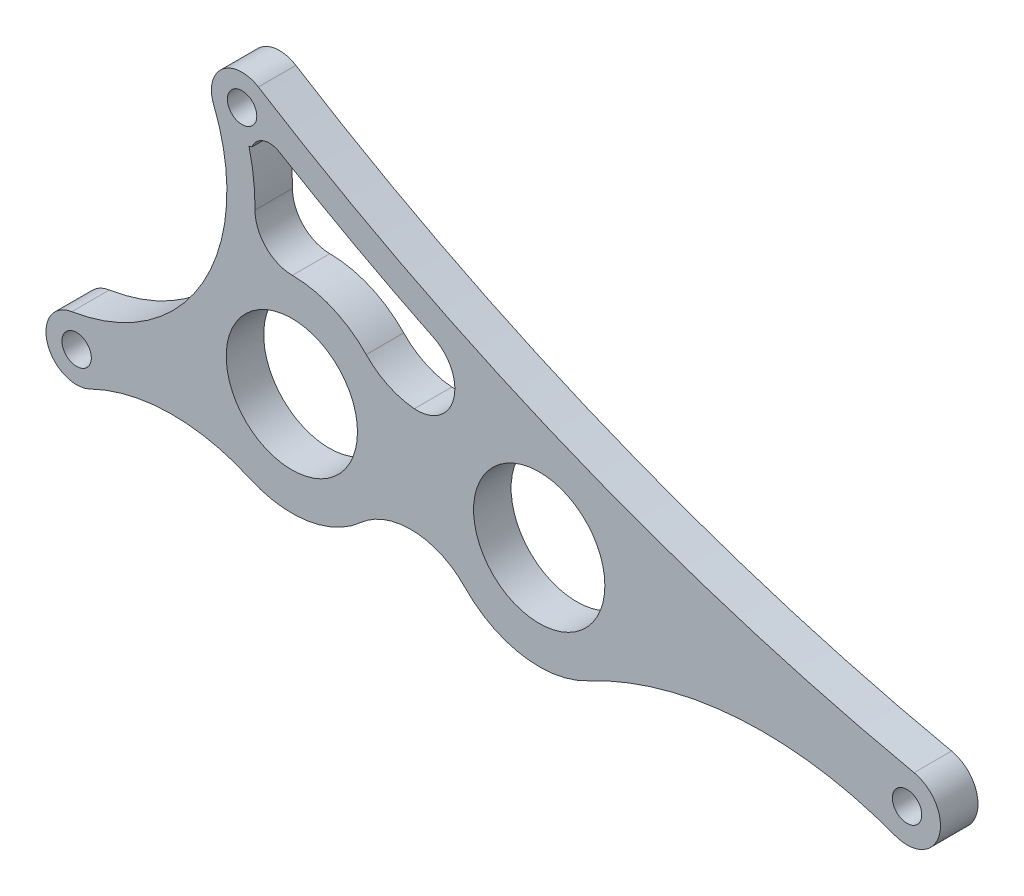
ISO-10303-21;
HEADER;
FILE_DESCRIPTION(('STEP AP214'),'2;1');
FILE_NAME('part.step','',(''),(''),'','','');
FILE_SCHEMA(('AUTOMOTIVE_DESIGN { 1 0 10303 214 1 1 1 1 }'));
ENDSEC;
DATA;
#1=APPLICATION_CONTEXT('core data for automotive mechanical design processes');
#2=APPLICATION_PROTOCOL_DEFINITION('international standard','automotive_design',2000,#1);
#3=PRODUCT_CONTEXT('',#1,'mechanical');
#4=PRODUCT('Part','Part','',(#3));
#5=PRODUCT_RELATED_PRODUCT_CATEGORY('part','',(#4));
#6=PRODUCT_DEFINITION_FORMATION('','',#4);
#7=PRODUCT_DEFINITION_CONTEXT('part definition',#1,'design');
#8=PRODUCT_DEFINITION('design','',#6,#7);
#9=PRODUCT_DEFINITION_SHAPE('','',#8);
#10=(LENGTH_UNIT() NAMED_UNIT(*) SI_UNIT(.MILLI.,.METRE.));
#11=(NAMED_UNIT(*) PLANE_ANGLE_UNIT() SI_UNIT($,.RADIAN.));
#12=(NAMED_UNIT(*) SI_UNIT($,.STERADIAN.) SOLID_ANGLE_UNIT());
#13=UNCERTAINTY_MEASURE_WITH_UNIT(LENGTH_MEASURE(1.E-05),#10,'distance_accuracy_value','');
#14=(GEOMETRIC_REPRESENTATION_CONTEXT(3) GLOBAL_UNCERTAINTY_ASSIGNED_CONTEXT((#13)) GLOBAL_UNIT_ASSIGNED_CONTEXT((#10,
#11,#12)) REPRESENTATION_CONTEXT('',''));
#15=CARTESIAN_POINT('',(0.,0.,0.));
#16=DIRECTION('',(0.,0.,1.));
#17=DIRECTION('',(1.,0.,0.));
#18=AXIS2_PLACEMENT_3D('',#15,#16,#17);
#19=CARTESIAN_POINT('',(632.61066878042,506.895195811641,6.35));
#20=DIRECTION('',(0.,0.,-1.));
#21=DIRECTION('',(-1.,0.,0.));
#22=AXIS2_PLACEMENT_3D('',#19,#20,#21);
#23=CYLINDRICAL_SURFACE('',#22,350.88304049089);
#24=CARTESIAN_POINT('',(632.61066878042,506.895195811641,0.));
#25=DIRECTION('',(0.,0.,1.));
#26=DIRECTION('',(1.,0.,0.));
#27=AXIS2_PLACEMENT_3D('',#24,#25,#26);
#28=CIRCLE('',#27,350.88304049089);
#29=CARTESIAN_POINT('',(478.677557343636,191.58026545229,0.));
#30=VERTEX_POINT('',#29);
#31=CARTESIAN_POINT('',(452.492063574284,205.770311149599,0.));
#32=VERTEX_POINT('',#31);
#33=EDGE_CURVE('E232',#30,#32,#28,.F.);
#34=ORIENTED_EDGE('',*,*,#33,.F.);
#35=DIRECTION('',(0.,0.,-1.));
#36=VECTOR('',#35,1.);
#37=CARTESIAN_POINT('',(478.677557343636,191.58026545229,6.35));
#38=LINE('',#37,#36);
#39=CARTESIAN_POINT('',(478.677557343636,191.58026545229,6.35));
#40=VERTEX_POINT('',#39);
#41=EDGE_CURVE('E200',#30,#40,#38,.F.);
#42=ORIENTED_EDGE('',*,*,#41,.T.);
#43=CARTESIAN_POINT('',(632.61066878042,506.895195811641,6.35));
#44=DIRECTION('',(0.,0.,1.));
#45=DIRECTION('',(1.,0.,0.));
#46=AXIS2_PLACEMENT_3D('',#43,#44,#45);
#47=CIRCLE('',#46,350.88304049089);
#48=CARTESIAN_POINT('',(452.492063574284,205.770311149599,6.35));
#49=VERTEX_POINT('',#48);
#50=EDGE_CURVE('E216',#40,#49,#47,.F.);
#51=ORIENTED_EDGE('',*,*,#50,.T.);
#52=DIRECTION('',(0.,0.,-1.));
#53=VECTOR('',#52,1.);
#54=CARTESIAN_POINT('',(452.492063574284,205.770311149599,6.35));
#55=LINE('',#54,#53);
#56=EDGE_CURVE('E188',#49,#32,#55,.T.);
#57=ORIENTED_EDGE('',*,*,#56,.T.);
#58=EDGE_LOOP('',(#34,#42,#51,#57));
#59=FACE_BOUND('',#58,.T.);
#60=ADVANCED_FACE('F37',(#59),#23,.T.);
#61=CARTESIAN_POINT('',(476.397755762043,192.203759657229,6.35));
#62=DIRECTION('',(0.,0.,-1.));
#63=DIRECTION('',(-1.,0.,0.));
#64=AXIS2_PLACEMENT_3D('',#61,#62,#63);
#65=CYLINDRICAL_SURFACE('',#64,12.7);
#66=CARTESIAN_POINT('',(476.397755762043,192.203759657229,6.35));
#67=DIRECTION('',(0.,0.,1.));
#68=DIRECTION('',(1.,0.,0.));
#69=AXIS2_PLACEMENT_3D('',#66,#67,#68);
#70=CIRCLE('',#69,12.7);
#71=CARTESIAN_POINT('',(475.385842808314,179.54413753909,6.35));
#72=VERTEX_POINT('',#71);
#73=CARTESIAN_POINT('',(467.238937845187,183.40568859785,6.35));
#74=VERTEX_POINT('',#73);
#75=EDGE_CURVE('E214',#72,#74,#70,.F.);
#76=ORIENTED_EDGE('',*,*,#75,.F.);
#77=DIRECTION('',(0.,0.,-1.));
#78=VECTOR('',#77,1.);
#79=CARTESIAN_POINT('',(475.385842808314,179.54413753909,6.35));
#80=LINE('',#79,#78);
#81=CARTESIAN_POINT('',(475.385842808314,179.54413753909,0.));
#82=VERTEX_POINT('',#81);
#83=EDGE_CURVE('E197',#72,#82,#80,.T.);
#84=ORIENTED_EDGE('',*,*,#83,.T.);
#85=CARTESIAN_POINT('',(476.397755762043,192.203759657229,0.));
#86=DIRECTION('',(0.,0.,1.));
#87=DIRECTION('',(1.,0.,0.));
#88=AXIS2_PLACEMENT_3D('',#85,#86,#87);
#89=CIRCLE('',#88,12.7);
#90=CARTESIAN_POINT('',(467.238937845187,183.40568859785,0.));
#91=VERTEX_POINT('',#90);
#92=EDGE_CURVE('E233',#82,#91,#89,.F.);
#93=ORIENTED_EDGE('',*,*,#92,.T.);
#94=DIRECTION('',(0.,0.,-1.));
#95=VECTOR('',#94,1.);
#96=CARTESIAN_POINT('',(467.238937845187,183.40568859785,6.35));
#97=LINE('',#96,#95);
#98=EDGE_CURVE('E201',#74,#91,#97,.T.);
#99=ORIENTED_EDGE('',*,*,#98,.F.);
#100=EDGE_LOOP('',(#76,#84,#93,#99));
#101=FACE_BOUND('',#100,.T.);
#102=ADVANCED_FACE('F222',(#101),#65,.F.);
#103=CARTESIAN_POINT('',(454.64556320951,171.308340891204,6.35));
#104=DIRECTION('',(0.,0.,-1.));
#105=DIRECTION('',(-1.,0.,0.));
#106=AXIS2_PLACEMENT_3D('',#103,#104,#105);
#107=CYLINDRICAL_SURFACE('',#106,17.4625);
#108=CARTESIAN_POINT('',(454.64556320951,171.308340891204,0.));
#109=DIRECTION('',(0.,0.,1.));
#110=DIRECTION('',(1.,0.,0.));
#111=AXIS2_PLACEMENT_3D('',#108,#109,#110);
#112=CIRCLE('',#111,17.4625);
#113=CARTESIAN_POINT('',(454.73164697502,188.770628709108,0.));
#114=VERTEX_POINT('',#113);
#115=EDGE_CURVE('E239',#91,#114,#112,.T.);
#116=ORIENTED_EDGE('',*,*,#115,.T.);
#117=DIRECTION('',(0.,0.,-1.));
#118=VECTOR('',#117,1.);
#119=CARTESIAN_POINT('',(454.73164697502,188.770628709108,6.35));
#120=LINE('',#119,#118);
#121=CARTESIAN_POINT('',(454.73164697502,188.770628709108,6.35));
#122=VERTEX_POINT('',#121);
#123=EDGE_CURVE('E52',#114,#122,#120,.F.);
#124=ORIENTED_EDGE('',*,*,#123,.T.);
#125=CARTESIAN_POINT('',(454.64556320951,171.308340891204,6.35));
#126=DIRECTION('',(0.,0.,1.));
#127=DIRECTION('',(1.,0.,0.));
#128=AXIS2_PLACEMENT_3D('',#125,#126,#127);
#129=CIRCLE('',#128,17.4625);
#130=EDGE_CURVE('E225',#74,#122,#129,.T.);
#131=ORIENTED_EDGE('',*,*,#130,.F.);
#132=ORIENTED_EDGE('',*,*,#98,.T.);
#133=EDGE_LOOP('',(#116,#124,#131,#132));
#134=FACE_BOUND('',#133,.T.);
#135=ADVANCED_FACE('F390',(#134),#107,.T.);
#136=CARTESIAN_POINT('',(412.506160535641,195.538311775231,6.35));
#137=DIRECTION('',(0.,0.,-1.));
#138=DIRECTION('',(-1.,0.,0.));
#139=AXIS2_PLACEMENT_3D('',#136,#137,#138);
#140=CYLINDRICAL_SURFACE('',#139,35.9088546126245);
#141=CARTESIAN_POINT('',(412.506160535641,195.538311775231,6.35));
#142=DIRECTION('',(0.,0.,1.));
#143=DIRECTION('',(1.,0.,0.));
#144=AXIS2_PLACEMENT_3D('',#141,#142,#143);
#145=CIRCLE('',#144,35.9088546126245);
#146=CARTESIAN_POINT('',(448.413260456259,195.183326027106,6.35));
#147=VERTEX_POINT('',#146);
#148=CARTESIAN_POINT('',(447.393688423649,204.041619217284,6.35));
#149=VERTEX_POINT('',#148);
#150=EDGE_CURVE('E350',#147,#149,#145,.T.);
#151=ORIENTED_EDGE('',*,*,#150,.F.);
#152=DIRECTION('',(0.,0.,-1.));
#153=VECTOR('',#152,1.);
#154=CARTESIAN_POINT('',(448.413260456259,195.183326027106,6.35));
#155=LINE('',#154,#153);
#156=CARTESIAN_POINT('',(448.413260456259,195.183326027106,0.));
#157=VERTEX_POINT('',#156);
#158=EDGE_CURVE('E203',#147,#157,#155,.T.);
#159=ORIENTED_EDGE('',*,*,#158,.T.);
#160=CARTESIAN_POINT('',(412.506160535641,195.538311775231,0.));
#161=DIRECTION('',(0.,0.,1.));
#162=DIRECTION('',(1.,0.,0.));
#163=AXIS2_PLACEMENT_3D('',#160,#161,#162);
#164=CIRCLE('',#163,35.9088546126245);
#165=CARTESIAN_POINT('',(447.393688423649,204.041619217284,0.));
#166=VERTEX_POINT('',#165);
#167=EDGE_CURVE('E245',#157,#166,#164,.T.);
#168=ORIENTED_EDGE('',*,*,#167,.T.);
#169=DIRECTION('',(0.,0.,-1.));
#170=VECTOR('',#169,1.);
#171=CARTESIAN_POINT('',(447.393688423649,204.041619217284,6.35));
#172=LINE('',#171,#170);
#173=EDGE_CURVE('E267',#149,#166,#172,.T.);
#174=ORIENTED_EDGE('',*,*,#173,.F.);
#175=EDGE_LOOP('',(#151,#159,#168,#174));
#176=FACE_BOUND('',#175,.T.);
#177=ADVANCED_FACE('F422',(#176),#140,.T.);
#178=CARTESIAN_POINT('',(446.22078607599,209.101762750116,6.35));
#179=DIRECTION('',(0.,0.,-1.));
#180=DIRECTION('',(-1.,0.,0.));
#181=AXIS2_PLACEMENT_3D('',#178,#179,#180);
#182=CYLINDRICAL_SURFACE('',#181,5.1943);
#183=CARTESIAN_POINT('',(446.22078607599,209.101762750116,0.));
#184=DIRECTION('',(0.,0.,1.));
#185=DIRECTION('',(1.,0.,0.));
#186=AXIS2_PLACEMENT_3D('',#183,#184,#185);
#187=CIRCLE('',#186,5.1943);
#188=CARTESIAN_POINT('',(447.899172428211,204.186096799028,0.));
#189=VERTEX_POINT('',#188);
#190=EDGE_CURVE('E247',#166,#189,#187,.T.);
#191=ORIENTED_EDGE('',*,*,#190,.T.);
#192=DIRECTION('',(0.,0.,-1.));
#193=VECTOR('',#192,1.);
#194=CARTESIAN_POINT('',(447.899172428211,204.186096799028,6.35));
#195=LINE('',#194,#193);
#196=CARTESIAN_POINT('',(447.899172428211,204.186096799028,6.35));
#197=VERTEX_POINT('',#196);
#198=EDGE_CURVE('E191',#197,#189,#195,.T.);
#199=ORIENTED_EDGE('',*,*,#198,.F.);
#200=CARTESIAN_POINT('',(446.22078607599,209.101762750116,6.35));
#201=DIRECTION('',(0.,0.,1.));
#202=DIRECTION('',(1.,0.,0.));
#203=AXIS2_PLACEMENT_3D('',#200,#201,#202);
#204=CIRCLE('',#203,5.1943);
#205=EDGE_CURVE('E348',#149,#197,#204,.T.);
#206=ORIENTED_EDGE('',*,*,#205,.F.);
#207=ORIENTED_EDGE('',*,*,#173,.T.);
#208=EDGE_LOOP('',(#191,#199,#206,#207));
#209=FACE_BOUND('',#208,.T.);
#210=ADVANCED_FACE('F419',(#209),#182,.T.);
#211=CARTESIAN_POINT('',(558.800000000003,162.941000000005,6.35));
#212=DIRECTION('',(0.,0.,-1.));
#213=DIRECTION('',(-1.,0.,0.));
#214=AXIS2_PLACEMENT_3D('',#211,#212,#213);
#215=CYLINDRICAL_SURFACE('',#214,5.66419999999934);
#216=CARTESIAN_POINT('',(558.800000000003,162.941000000005,0.));
#217=DIRECTION('',(0.,0.,1.));
#218=DIRECTION('',(1.,0.,0.));
#219=AXIS2_PLACEMENT_3D('',#216,#217,#218);
#220=CIRCLE('',#219,5.66419999999934);
#221=CARTESIAN_POINT('',(556.805506699175,157.639570182216,0.));
#222=VERTEX_POINT('',#221);
#223=CARTESIAN_POINT('',(559.98844947488,168.479117864917,0.));
#224=VERTEX_POINT('',#223);
#225=EDGE_CURVE('E187',#222,#224,#220,.T.);
#226=ORIENTED_EDGE('',*,*,#225,.T.);
#227=DIRECTION('',(0.,0.,-1.));
#228=VECTOR('',#227,1.);
#229=CARTESIAN_POINT('',(559.98844947488,168.479117864917,6.35));
#230=LINE('',#229,#228);
#231=CARTESIAN_POINT('',(559.98844947488,168.479117864917,6.35));
#232=VERTEX_POINT('',#231);
#233=EDGE_CURVE('E166',#232,#224,#230,.T.);
#234=ORIENTED_EDGE('',*,*,#233,.F.);
#235=CARTESIAN_POINT('',(558.800000000003,162.941000000005,6.35));
#236=DIRECTION('',(0.,0.,1.));
#237=DIRECTION('',(1.,0.,0.));
#238=AXIS2_PLACEMENT_3D('',#235,#236,#237);
#239=CIRCLE('',#238,5.66419999999934);
#240=CARTESIAN_POINT('',(556.805506699175,157.639570182216,6.35));
#241=VERTEX_POINT('',#240);
#242=EDGE_CURVE('E173',#241,#232,#239,.T.);
#243=ORIENTED_EDGE('',*,*,#242,.F.);
#244=DIRECTION('',(0.,0.,-1.));
#245=VECTOR('',#244,1.);
#246=CARTESIAN_POINT('',(556.805506699175,157.639570182216,6.35));
#247=LINE('',#246,#245);
#248=EDGE_CURVE('E271',#241,#222,#247,.T.);
#249=ORIENTED_EDGE('',*,*,#248,.T.);
#250=EDGE_LOOP('',(#226,#234,#243,#249));
#251=FACE_BOUND('',#250,.T.);
#252=ADVANCED_FACE('F185',(#251),#215,.T.);
#253=CARTESIAN_POINT('',(632.61066878042,506.895195811641,6.35));
#254=DIRECTION('',(0.,0.,-1.));
#255=DIRECTION('',(-1.,0.,0.));
#256=AXIS2_PLACEMENT_3D('',#253,#254,#255);
#257=CYLINDRICAL_SURFACE('',#256,346.12054049089);
#258=CARTESIAN_POINT('',(632.61066878042,506.895195811641,0.));
#259=DIRECTION('',(0.,0.,1.));
#260=DIRECTION('',(1.,0.,0.));
#261=AXIS2_PLACEMENT_3D('',#258,#259,#260);
#262=CIRCLE('',#261,346.12054049089);
#263=CARTESIAN_POINT('',(448.976618896428,213.504731970517,0.));
#264=VERTEX_POINT('',#263);
#265=EDGE_CURVE('E305',#224,#264,#262,.F.);
#266=ORIENTED_EDGE('',*,*,#265,.T.);
#267=DIRECTION('',(0.,0.,-1.));
#268=VECTOR('',#267,1.);
#269=CARTESIAN_POINT('',(448.976618896428,213.504731970517,6.35));
#270=LINE('',#269,#268);
#271=CARTESIAN_POINT('',(448.976618896428,213.504731970517,6.35));
#272=VERTEX_POINT('',#271);
#273=EDGE_CURVE('E169',#272,#264,#270,.T.);
#274=ORIENTED_EDGE('',*,*,#273,.F.);
#275=CARTESIAN_POINT('',(632.61066878042,506.895195811641,6.35));
#276=DIRECTION('',(0.,0.,1.));
#277=DIRECTION('',(1.,0.,0.));
#278=AXIS2_PLACEMENT_3D('',#275,#276,#277);
#279=CIRCLE('',#278,346.12054049089);
#280=EDGE_CURVE('E162',#232,#272,#279,.F.);
#281=ORIENTED_EDGE('',*,*,#280,.F.);
#282=ORIENTED_EDGE('',*,*,#233,.T.);
#283=EDGE_LOOP('',(#266,#274,#281,#282));
#284=FACE_BOUND('',#283,.T.);
#285=ADVANCED_FACE('F164',(#284),#257,.F.);
#286=CARTESIAN_POINT('',(446.22078607599,209.101762750116,6.35));
#287=DIRECTION('',(0.,0.,-1.));
#288=DIRECTION('',(-1.,0.,0.));
#289=AXIS2_PLACEMENT_3D('',#286,#287,#288);
#290=CYLINDRICAL_SURFACE('',#289,5.1943);
#291=CARTESIAN_POINT('',(446.22078607599,209.101762750116,0.));
#292=DIRECTION('',(0.,0.,1.));
#293=DIRECTION('',(1.,0.,0.));
#294=AXIS2_PLACEMENT_3D('',#291,#292,#293);
#295=CIRCLE('',#294,5.1943);
#296=CARTESIAN_POINT('',(441.401833822351,207.16309009411,0.));
#297=VERTEX_POINT('',#296);
#298=EDGE_CURVE('E302',#264,#297,#295,.T.);
#299=ORIENTED_EDGE('',*,*,#298,.T.);
#300=DIRECTION('',(0.,0.,-1.));
#301=VECTOR('',#300,1.);
#302=CARTESIAN_POINT('',(441.401833822351,207.16309009411,6.35));
#303=LINE('',#302,#301);
#304=CARTESIAN_POINT('',(441.401833822351,207.16309009411,6.35));
#305=VERTEX_POINT('',#304);
#306=EDGE_CURVE('E193',#305,#297,#303,.T.);
#307=ORIENTED_EDGE('',*,*,#306,.F.);
#308=CARTESIAN_POINT('',(446.22078607599,209.101762750116,6.35));
#309=DIRECTION('',(0.,0.,1.));
#310=DIRECTION('',(1.,0.,0.));
#311=AXIS2_PLACEMENT_3D('',#308,#309,#310);
#312=CIRCLE('',#311,5.1943);
#313=EDGE_CURVE('E172',#272,#305,#312,.T.);
#314=ORIENTED_EDGE('',*,*,#313,.F.);
#315=ORIENTED_EDGE('',*,*,#273,.T.);
#316=EDGE_LOOP('',(#299,#307,#314,#315));
#317=FACE_BOUND('',#316,.T.);
#318=ADVANCED_FACE('F303',(#317),#290,.T.);
#319=CARTESIAN_POINT('',(412.506160535641,195.538311775231,6.35));
#320=DIRECTION('',(0.,0.,-1.));
#321=DIRECTION('',(-1.,0.,0.));
#322=AXIS2_PLACEMENT_3D('',#319,#320,#321);
#323=CYLINDRICAL_SURFACE('',#322,31.1463546126245);
#324=CARTESIAN_POINT('',(412.506160535641,195.538311775231,0.));
#325=DIRECTION('',(0.,0.,1.));
#326=DIRECTION('',(1.,0.,0.));
#327=AXIS2_PLACEMENT_3D('',#324,#325,#326);
#328=CIRCLE('',#327,31.1463546126245);
#329=CARTESIAN_POINT('',(417.394158023851,164.777900753747,0.));
#330=VERTEX_POINT('',#329);
#331=EDGE_CURVE('E297',#330,#297,#328,.T.);
#332=ORIENTED_EDGE('',*,*,#331,.F.);
#333=DIRECTION('',(0.,0.,-1.));
#334=VECTOR('',#333,1.);
#335=CARTESIAN_POINT('',(417.394158023851,164.777900753747,6.35));
#336=LINE('',#335,#334);
#337=CARTESIAN_POINT('',(417.394158023851,164.777900753747,6.35));
#338=VERTEX_POINT('',#337);
#339=EDGE_CURVE('E289',#338,#330,#336,.T.);
#340=ORIENTED_EDGE('',*,*,#339,.F.);
#341=CARTESIAN_POINT('',(412.506160535641,195.538311775231,6.35));
#342=DIRECTION('',(0.,0.,1.));
#343=DIRECTION('',(1.,0.,0.));
#344=AXIS2_PLACEMENT_3D('',#341,#342,#343);
#345=CIRCLE('',#344,31.1463546126245);
#346=EDGE_CURVE('E299',#338,#305,#345,.T.);
#347=ORIENTED_EDGE('',*,*,#346,.T.);
#348=ORIENTED_EDGE('',*,*,#306,.T.);
#349=EDGE_LOOP('',(#332,#340,#347,#348));
#350=FACE_BOUND('',#349,.T.);
#351=ADVANCED_FACE('F295',(#350),#323,.F.);
#352=CARTESIAN_POINT('',(418.209332886809,159.647964844518,6.35));
#353=DIRECTION('',(0.,0.,-1.));
#354=DIRECTION('',(-1.,0.,0.));
#355=AXIS2_PLACEMENT_3D('',#352,#353,#354);
#356=CYLINDRICAL_SURFACE('',#355,5.1943);
#357=CARTESIAN_POINT('',(418.209332886809,159.647964844518,0.));
#358=DIRECTION('',(0.,0.,1.));
#359=DIRECTION('',(1.,0.,0.));
#360=AXIS2_PLACEMENT_3D('',#357,#358,#359);
#361=CIRCLE('',#360,5.1943);
#362=CARTESIAN_POINT('',(420.487623905389,154.979973571534,0.));
#363=VERTEX_POINT('',#362);
#364=EDGE_CURVE('E309',#330,#363,#361,.T.);
#365=ORIENTED_EDGE('',*,*,#364,.T.);
#366=DIRECTION('',(0.,0.,-1.));
#367=VECTOR('',#366,1.);
#368=CARTESIAN_POINT('',(420.487623905389,154.979973571534,6.35));
#369=LINE('',#368,#367);
#370=CARTESIAN_POINT('',(420.487623905389,154.979973571534,6.35));
#371=VERTEX_POINT('',#370);
#372=EDGE_CURVE('E286',#371,#363,#369,.T.);
#373=ORIENTED_EDGE('',*,*,#372,.F.);
#374=CARTESIAN_POINT('',(418.209332886809,159.647964844518,6.35));
#375=DIRECTION('',(0.,0.,1.));
#376=DIRECTION('',(1.,0.,0.));
#377=AXIS2_PLACEMENT_3D('',#374,#375,#376);
#378=CIRCLE('',#377,5.1943);
#379=EDGE_CURVE('E362',#338,#371,#378,.T.);
#380=ORIENTED_EDGE('',*,*,#379,.F.);
#381=ORIENTED_EDGE('',*,*,#339,.T.);
#382=EDGE_LOOP('',(#365,#373,#380,#381));
#383=FACE_BOUND('',#382,.T.);
#384=ADVANCED_FACE('F370',(#383),#356,.T.);
#385=CARTESIAN_POINT('',(434.413608126534,126.447019580185,6.35));
#386=DIRECTION('',(0.,0.,-1.));
#387=DIRECTION('',(-1.,0.,0.));
#388=AXIS2_PLACEMENT_3D('',#385,#386,#387);
#389=CYLINDRICAL_SURFACE('',#388,31.75);
#390=CARTESIAN_POINT('',(434.413608126534,126.447019580185,0.));
#391=DIRECTION('',(0.,0.,1.));
#392=DIRECTION('',(1.,0.,0.));
#393=AXIS2_PLACEMENT_3D('',#390,#391,#392);
#394=CIRCLE('',#393,31.75);
#395=CARTESIAN_POINT('',(447.466482373615,155.389807522778,0.));
#396=VERTEX_POINT('',#395);
#397=EDGE_CURVE('E311',#363,#396,#394,.F.);
#398=ORIENTED_EDGE('',*,*,#397,.T.);
#399=DIRECTION('',(0.,0.,-1.));
#400=VECTOR('',#399,1.);
#401=CARTESIAN_POINT('',(447.466482373615,155.389807522778,6.35));
#402=LINE('',#401,#400);
#403=CARTESIAN_POINT('',(447.466482373615,155.389807522778,6.35));
#404=VERTEX_POINT('',#403);
#405=EDGE_CURVE('E283',#404,#396,#402,.T.);
#406=ORIENTED_EDGE('',*,*,#405,.F.);
#407=CARTESIAN_POINT('',(434.413608126534,126.447019580185,6.35));
#408=DIRECTION('',(0.,0.,1.));
#409=DIRECTION('',(1.,0.,0.));
#410=AXIS2_PLACEMENT_3D('',#407,#408,#409);
#411=CIRCLE('',#410,31.75);
#412=EDGE_CURVE('E360',#371,#404,#411,.F.);
#413=ORIENTED_EDGE('',*,*,#412,.F.);
#414=ORIENTED_EDGE('',*,*,#372,.T.);
#415=EDGE_LOOP('',(#398,#406,#413,#414));
#416=FACE_BOUND('',#415,.T.);
#417=ADVANCED_FACE('F372',(#416),#389,.F.);
#418=CARTESIAN_POINT('',(466.298876995837,158.302988760355,0.));
#419=VERTEX_POINT('',#418);
#420=EDGE_CURVE('E316',#396,#419,#112,.T.);
#421=ORIENTED_EDGE('',*,*,#420,.T.);
#422=DIRECTION('',(0.,0.,-1.));
#423=VECTOR('',#422,1.);
#424=CARTESIAN_POINT('',(466.298876995837,158.302988760355,6.35));
#425=LINE('',#424,#423);
#426=CARTESIAN_POINT('',(466.298876995837,158.302988760355,6.35));
#427=VERTEX_POINT('',#426);
#428=EDGE_CURVE('E280',#427,#419,#425,.T.);
#429=ORIENTED_EDGE('',*,*,#428,.F.);
#430=EDGE_CURVE('E358',#404,#427,#129,.T.);
#431=ORIENTED_EDGE('',*,*,#430,.F.);
#432=ORIENTED_EDGE('',*,*,#405,.T.);
#433=EDGE_LOOP('',(#421,#429,#431,#432));
#434=FACE_BOUND('',#433,.T.);
#435=ADVANCED_FACE('F377',(#434),#107,.T.);
#436=CARTESIAN_POINT('',(474.774014294985,148.84455084701,6.35));
#437=DIRECTION('',(0.,0.,-1.));
#438=DIRECTION('',(-1.,0.,0.));
#439=AXIS2_PLACEMENT_3D('',#436,#437,#438);
#440=CYLINDRICAL_SURFACE('',#439,12.7);
#441=CARTESIAN_POINT('',(474.774014294985,148.84455084701,0.));
#442=DIRECTION('',(0.,0.,1.));
#443=DIRECTION('',(1.,0.,0.));
#444=AXIS2_PLACEMENT_3D('',#441,#442,#443);
#445=CIRCLE('',#444,12.7);
#446=CARTESIAN_POINT('',(483.932832211841,157.642621906389,0.));
#447=VERTEX_POINT('',#446);
#448=EDGE_CURVE('E318',#419,#447,#445,.F.);
#449=ORIENTED_EDGE('',*,*,#448,.T.);
#450=DIRECTION('',(0.,0.,-1.));
#451=VECTOR('',#450,1.);
#452=CARTESIAN_POINT('',(483.932832211841,157.642621906389,6.35));
#453=LINE('',#452,#451);
#454=CARTESIAN_POINT('',(483.932832211841,157.642621906389,6.35));
#455=VERTEX_POINT('',#454);
#456=EDGE_CURVE('E277',#455,#447,#453,.T.);
#457=ORIENTED_EDGE('',*,*,#456,.F.);
#458=CARTESIAN_POINT('',(474.774014294985,148.84455084701,6.35));
#459=DIRECTION('',(0.,0.,1.));
#460=DIRECTION('',(1.,0.,0.));
#461=AXIS2_PLACEMENT_3D('',#458,#459,#460);
#462=CIRCLE('',#461,12.7);
#463=EDGE_CURVE('E356',#427,#455,#462,.F.);
#464=ORIENTED_EDGE('',*,*,#463,.F.);
#465=ORIENTED_EDGE('',*,*,#428,.T.);
#466=EDGE_LOOP('',(#449,#457,#464,#465));
#467=FACE_BOUND('',#466,.T.);
#468=ADVANCED_FACE('F380',(#467),#440,.F.);
#469=CARTESIAN_POINT('',(496.526206847518,169.739969613035,6.35));
#470=DIRECTION('',(0.,0.,-1.));
#471=DIRECTION('',(-1.,0.,0.));
#472=AXIS2_PLACEMENT_3D('',#469,#470,#471);
#473=CYLINDRICAL_SURFACE('',#472,17.4624999999999);
#474=CARTESIAN_POINT('',(496.526206847518,169.739969613035,0.));
#475=DIRECTION('',(0.,0.,1.));
#476=DIRECTION('',(1.,0.,0.));
#477=AXIS2_PLACEMENT_3D('',#474,#475,#476);
#478=CIRCLE('',#477,17.4624999999999);
#479=CARTESIAN_POINT('',(504.704924579279,154.311182152117,0.));
#480=VERTEX_POINT('',#479);
#481=EDGE_CURVE('E241',#447,#480,#478,.T.);
#482=ORIENTED_EDGE('',*,*,#481,.T.);
#483=DIRECTION('',(0.,0.,-1.));
#484=VECTOR('',#483,1.);
#485=CARTESIAN_POINT('',(504.704924579279,154.311182152117,6.35));
#486=LINE('',#485,#484);
#487=CARTESIAN_POINT('',(504.704924579279,154.311182152117,6.35));
#488=VERTEX_POINT('',#487);
#489=EDGE_CURVE('E273',#488,#480,#486,.T.);
#490=ORIENTED_EDGE('',*,*,#489,.F.);
#491=CARTESIAN_POINT('',(496.526206847518,169.739969613035,6.35));
#492=DIRECTION('',(0.,0.,1.));
#493=DIRECTION('',(1.,0.,0.));
#494=AXIS2_PLACEMENT_3D('',#491,#492,#493);
#495=CIRCLE('',#494,17.4624999999999);
#496=EDGE_CURVE('E354',#455,#488,#495,.T.);
#497=ORIENTED_EDGE('',*,*,#496,.F.);
#498=ORIENTED_EDGE('',*,*,#456,.T.);
#499=EDGE_LOOP('',(#482,#490,#497,#498));
#500=FACE_BOUND('',#499,.T.);
#501=ADVANCED_FACE('F322',(#500),#473,.T.);
#502=CARTESIAN_POINT('',(496.526206847518,169.739969613035,6.35));
#503=DIRECTION('',(0.,0.,-1.));
#504=DIRECTION('',(-1.,0.,0.));
#505=AXIS2_PLACEMENT_3D('',#502,#503,#504);
#506=CYLINDRICAL_SURFACE('',#505,11.1125);
#507=CARTESIAN_POINT('',(496.526206847518,169.739969613035,6.35));
#508=DIRECTION('',(0.,0.,1.));
#509=DIRECTION('',(1.,0.,0.));
#510=AXIS2_PLACEMENT_3D('',#507,#508,#509);
#511=CIRCLE('',#510,11.1125);
#512=CARTESIAN_POINT('',(507.638706847518,169.739969613035,6.35));
#513=VERTEX_POINT('',#512);
#514=EDGE_CURVE('E333',#513,#513,#511,.T.);
#515=ORIENTED_EDGE('',*,*,#514,.T.);
#516=EDGE_LOOP('',(#515));
#517=FACE_BOUND('',#516,.T.);
#518=CARTESIAN_POINT('',(496.526206847518,169.739969613035,0.));
#519=DIRECTION('',(0.,0.,1.));
#520=DIRECTION('',(1.,0.,0.));
#521=AXIS2_PLACEMENT_3D('',#518,#519,#520);
#522=CIRCLE('',#521,11.1125);
#523=CARTESIAN_POINT('',(507.638706847518,169.739969613035,0.));
#524=VERTEX_POINT('',#523);
#525=EDGE_CURVE('E261',#524,#524,#522,.T.);
#526=ORIENTED_EDGE('',*,*,#525,.F.);
#527=EDGE_LOOP('',(#526));
#528=FACE_BOUND('',#527,.T.);
#529=ADVANCED_FACE('F387',(#517,#528),#506,.F.);
#530=CARTESIAN_POINT('',(418.209332886809,159.647964844518,6.35));
#531=DIRECTION('',(0.,0.,-1.));
#532=DIRECTION('',(-1.,0.,0.));
#533=AXIS2_PLACEMENT_3D('',#530,#531,#532);
#534=CYLINDRICAL_SURFACE('',#533,2.48920000000001);
#535=CARTESIAN_POINT('',(418.209332886809,159.647964844518,6.35));
#536=DIRECTION('',(0.,0.,1.));
#537=DIRECTION('',(1.,0.,0.));
#538=AXIS2_PLACEMENT_3D('',#535,#536,#537);
#539=CIRCLE('',#538,2.48920000000001);
#540=CARTESIAN_POINT('',(420.698532886809,159.647964844518,6.35));
#541=VERTEX_POINT('',#540);
#542=EDGE_CURVE('E336',#541,#541,#539,.T.);
#543=ORIENTED_EDGE('',*,*,#542,.T.);
#544=EDGE_LOOP('',(#543));
#545=FACE_BOUND('',#544,.T.);
#546=CARTESIAN_POINT('',(418.209332886809,159.647964844518,0.));
#547=DIRECTION('',(0.,0.,1.));
#548=DIRECTION('',(1.,0.,0.));
#549=AXIS2_PLACEMENT_3D('',#546,#547,#548);
#550=CIRCLE('',#549,2.48920000000001);
#551=CARTESIAN_POINT('',(420.698532886809,159.647964844518,0.));
#552=VERTEX_POINT('',#551);
#553=EDGE_CURVE('E258',#552,#552,#550,.T.);
#554=ORIENTED_EDGE('',*,*,#553,.F.);
#555=EDGE_LOOP('',(#554));
#556=FACE_BOUND('',#555,.T.);
#557=ADVANCED_FACE('F483',(#545,#556),#534,.F.);
#558=CARTESIAN_POINT('',(454.64556320951,171.308340891204,6.35));
#559=DIRECTION('',(0.,0.,-1.));
#560=DIRECTION('',(-1.,0.,0.));
#561=AXIS2_PLACEMENT_3D('',#558,#559,#560);
#562=CYLINDRICAL_SURFACE('',#561,11.1125);
#563=CARTESIAN_POINT('',(454.64556320951,171.308340891204,6.35));
#564=DIRECTION('',(0.,0.,1.));
#565=DIRECTION('',(1.,0.,0.));
#566=AXIS2_PLACEMENT_3D('',#563,#564,#565);
#567=CIRCLE('',#566,11.1125);
#568=CARTESIAN_POINT('',(465.75806320951,171.308340891204,6.35));
#569=VERTEX_POINT('',#568);
#570=EDGE_CURVE('E339',#569,#569,#567,.T.);
#571=ORIENTED_EDGE('',*,*,#570,.T.);
#572=EDGE_LOOP('',(#571));
#573=FACE_BOUND('',#572,.T.);
#574=CARTESIAN_POINT('',(454.64556320951,171.308340891204,0.));
#575=DIRECTION('',(0.,0.,1.));
#576=DIRECTION('',(1.,0.,0.));
#577=AXIS2_PLACEMENT_3D('',#574,#575,#576);
#578=CIRCLE('',#577,11.1125);
#579=CARTESIAN_POINT('',(465.75806320951,171.308340891204,0.));
#580=VERTEX_POINT('',#579);
#581=EDGE_CURVE('E255',#580,#580,#578,.T.);
#582=ORIENTED_EDGE('',*,*,#581,.F.);
#583=EDGE_LOOP('',(#582));
#584=FACE_BOUND('',#583,.T.);
#585=ADVANCED_FACE('F414',(#573,#584),#562,.F.);
#586=CARTESIAN_POINT('',(446.22078607599,209.101762750116,6.35));
#587=DIRECTION('',(0.,0.,-1.));
#588=DIRECTION('',(-1.,0.,0.));
#589=AXIS2_PLACEMENT_3D('',#586,#587,#588);
#590=CYLINDRICAL_SURFACE('',#589,2.48920000000001);
#591=CARTESIAN_POINT('',(446.22078607599,209.101762750116,6.35));
#592=DIRECTION('',(0.,0.,1.));
#593=DIRECTION('',(1.,0.,0.));
#594=AXIS2_PLACEMENT_3D('',#591,#592,#593);
#595=CIRCLE('',#594,2.48920000000001);
#596=CARTESIAN_POINT('',(448.70998607599,209.101762750116,6.35));
#597=VERTEX_POINT('',#596);
#598=EDGE_CURVE('E342',#597,#597,#595,.T.);
#599=ORIENTED_EDGE('',*,*,#598,.T.);
#600=EDGE_LOOP('',(#599));
#601=FACE_BOUND('',#600,.T.);
#602=CARTESIAN_POINT('',(446.22078607599,209.101762750116,0.));
#603=DIRECTION('',(0.,0.,1.));
#604=DIRECTION('',(1.,0.,0.));
#605=AXIS2_PLACEMENT_3D('',#602,#603,#604);
#606=CIRCLE('',#605,2.48920000000001);
#607=CARTESIAN_POINT('',(448.70998607599,209.101762750116,0.));
#608=VERTEX_POINT('',#607);
#609=EDGE_CURVE('E252',#608,#608,#606,.T.);
#610=ORIENTED_EDGE('',*,*,#609,.F.);
#611=EDGE_LOOP('',(#610));
#612=FACE_BOUND('',#611,.T.);
#613=ADVANCED_FACE('F408',(#601,#612),#590,.F.);
#614=CARTESIAN_POINT('',(450.862242507043,203.045552758699,6.35));
#615=DIRECTION('',(0.,0.,-1.));
#616=DIRECTION('',(-1.,0.,0.));
#617=AXIS2_PLACEMENT_3D('',#614,#615,#616);
#618=CYLINDRICAL_SURFACE('',#617,3.17500000000002);
#619=CARTESIAN_POINT('',(450.862242507043,203.045552758699,0.));
#620=DIRECTION('',(0.,0.,1.));
#621=DIRECTION('',(1.,0.,0.));
#622=AXIS2_PLACEMENT_3D('',#619,#620,#621);
#623=CIRCLE('',#622,3.17500000000002);
#624=EDGE_CURVE('E250',#32,#189,#623,.T.);
#625=ORIENTED_EDGE('',*,*,#624,.F.);
#626=ORIENTED_EDGE('',*,*,#56,.F.);
#627=CARTESIAN_POINT('',(450.862242507043,203.045552758699,6.35));
#628=DIRECTION('',(0.,0.,1.));
#629=DIRECTION('',(1.,0.,0.));
#630=AXIS2_PLACEMENT_3D('',#627,#628,#629);
#631=CIRCLE('',#630,3.17500000000002);
#632=EDGE_CURVE('E345',#49,#197,#631,.T.);
#633=ORIENTED_EDGE('',*,*,#632,.T.);
#634=ORIENTED_EDGE('',*,*,#198,.T.);
#635=EDGE_LOOP('',(#625,#626,#633,#634));
#636=FACE_BOUND('',#635,.T.);
#637=ADVANCED_FACE('F401',(#636),#618,.F.);
#638=CARTESIAN_POINT('',(534.44571633114,98.2065004760532,6.35));
#639=DIRECTION('',(0.,0.,-1.));
#640=DIRECTION('',(-1.,0.,0.));
#641=AXIS2_PLACEMENT_3D('',#638,#639,#640);
#642=CYLINDRICAL_SURFACE('',#641,63.5);
#643=CARTESIAN_POINT('',(534.44571633114,98.2065004760532,0.));
#644=DIRECTION('',(0.,0.,1.));
#645=DIRECTION('',(1.,0.,0.));
#646=AXIS2_PLACEMENT_3D('',#643,#644,#645);
#647=CIRCLE('',#646,63.5);
#648=EDGE_CURVE('E237',#480,#222,#647,.F.);
#649=ORIENTED_EDGE('',*,*,#648,.T.);
#650=ORIENTED_EDGE('',*,*,#248,.F.);
#651=CARTESIAN_POINT('',(534.44571633114,98.2065004760532,6.35));
#652=DIRECTION('',(0.,0.,1.));
#653=DIRECTION('',(1.,0.,0.));
#654=AXIS2_PLACEMENT_3D('',#651,#652,#653);
#655=CIRCLE('',#654,63.5);
#656=EDGE_CURVE('E179',#488,#241,#655,.F.);
#657=ORIENTED_EDGE('',*,*,#656,.F.);
#658=ORIENTED_EDGE('',*,*,#489,.T.);
#659=EDGE_LOOP('',(#649,#650,#657,#658));
#660=FACE_BOUND('',#659,.T.);
#661=ADVANCED_FACE('F328',(#660),#642,.F.);
#662=CARTESIAN_POINT('',(558.800000000004,162.941000000003,6.35));
#663=DIRECTION('',(0.,0.,-1.));
#664=DIRECTION('',(-1.,0.,0.));
#665=AXIS2_PLACEMENT_3D('',#662,#663,#664);
#666=CYLINDRICAL_SURFACE('',#665,2.48919999999917);
#667=CARTESIAN_POINT('',(558.800000000004,162.941000000003,6.35));
#668=DIRECTION('',(0.,0.,1.));
#669=DIRECTION('',(1.,0.,0.));
#670=AXIS2_PLACEMENT_3D('',#667,#668,#669);
#671=CIRCLE('',#670,2.48919999999917);
#672=CARTESIAN_POINT('',(561.289200000003,162.941000000003,6.35));
#673=VERTEX_POINT('',#672);
#674=EDGE_CURVE('E274',#673,#673,#671,.T.);
#675=ORIENTED_EDGE('',*,*,#674,.T.);
#676=EDGE_LOOP('',(#675));
#677=FACE_BOUND('',#676,.T.);
#678=CARTESIAN_POINT('',(558.800000000004,162.941000000003,0.));
#679=DIRECTION('',(0.,0.,1.));
#680=DIRECTION('',(1.,0.,0.));
#681=AXIS2_PLACEMENT_3D('',#678,#679,#680);
#682=CIRCLE('',#681,2.48919999999917);
#683=CARTESIAN_POINT('',(561.289200000003,162.941000000003,0.));
#684=VERTEX_POINT('',#683);
#685=EDGE_CURVE('E183',#684,#684,#682,.T.);
#686=ORIENTED_EDGE('',*,*,#685,.F.);
#687=EDGE_LOOP('',(#686));
#688=FACE_BOUND('',#687,.T.);
#689=ADVANCED_FACE('F400',(#677,#688),#666,.F.);
#690=CARTESIAN_POINT('',(0.,0.,6.35));
#691=DIRECTION('',(0.,0.,1.));
#692=DIRECTION('',(1.,0.,0.));
#693=AXIS2_PLACEMENT_3D('',#690,#691,#692);
#694=PLANE('',#693);
#695=ORIENTED_EDGE('',*,*,#242,.T.);
#696=ORIENTED_EDGE('',*,*,#280,.T.);
#697=ORIENTED_EDGE('',*,*,#313,.T.);
#698=ORIENTED_EDGE('',*,*,#346,.F.);
#699=ORIENTED_EDGE('',*,*,#379,.T.);
#700=ORIENTED_EDGE('',*,*,#412,.T.);
#701=ORIENTED_EDGE('',*,*,#430,.T.);
#702=ORIENTED_EDGE('',*,*,#463,.T.);
#703=ORIENTED_EDGE('',*,*,#496,.T.);
#704=ORIENTED_EDGE('',*,*,#656,.T.);
#705=EDGE_LOOP('',(#695,#696,#697,#698,#699,#700,#701,#702,#703,#704));
#706=FACE_BOUND('',#705,.T.);
#707=ORIENTED_EDGE('',*,*,#50,.F.);
#708=CARTESIAN_POINT('',(475.891799285178,185.873948598159,6.35));
#709=DIRECTION('',(0.,0.,1.));
#710=DIRECTION('',(1.,0.,0.));
#711=AXIS2_PLACEMENT_3D('',#708,#709,#710);
#712=CIRCLE('',#711,6.35);
#713=EDGE_CURVE('E209',#40,#72,#712,.F.);
#714=ORIENTED_EDGE('',*,*,#713,.T.);
#715=ORIENTED_EDGE('',*,*,#75,.T.);
#716=ORIENTED_EDGE('',*,*,#130,.T.);
#717=CARTESIAN_POINT('',(454.762950162478,195.120551551982,6.35));
#718=DIRECTION('',(0.,0.,1.));
#719=DIRECTION('',(1.,0.,0.));
#720=AXIS2_PLACEMENT_3D('',#717,#718,#719);
#721=CIRCLE('',#720,6.35);
#722=EDGE_CURVE('E11',#122,#147,#721,.F.);
#723=ORIENTED_EDGE('',*,*,#722,.T.);
#724=ORIENTED_EDGE('',*,*,#150,.T.);
#725=ORIENTED_EDGE('',*,*,#205,.T.);
#726=ORIENTED_EDGE('',*,*,#632,.F.);
#727=EDGE_LOOP('',(#707,#714,#715,#716,#723,#724,#725,#726));
#728=FACE_BOUND('',#727,.T.);
#729=ORIENTED_EDGE('',*,*,#598,.F.);
#730=EDGE_LOOP('',(#729));
#731=FACE_BOUND('',#730,.T.);
#732=ORIENTED_EDGE('',*,*,#570,.F.);
#733=EDGE_LOOP('',(#732));
#734=FACE_BOUND('',#733,.T.);
#735=ORIENTED_EDGE('',*,*,#542,.F.);
#736=EDGE_LOOP('',(#735));
#737=FACE_BOUND('',#736,.T.);
#738=ORIENTED_EDGE('',*,*,#514,.F.);
#739=EDGE_LOOP('',(#738));
#740=FACE_BOUND('',#739,.T.);
#741=ORIENTED_EDGE('',*,*,#674,.F.);
#742=EDGE_LOOP('',(#741));
#743=FACE_BOUND('',#742,.T.);
#744=ADVANCED_FACE('F176',(#706,#728,#731,#734,#737,#740,#743),#694,.T.);
#745=CARTESIAN_POINT('',(0.,0.,0.));
#746=DIRECTION('',(0.,0.,1.));
#747=DIRECTION('',(1.,0.,0.));
#748=AXIS2_PLACEMENT_3D('',#745,#746,#747);
#749=PLANE('',#748);
#750=ORIENTED_EDGE('',*,*,#225,.F.);
#751=ORIENTED_EDGE('',*,*,#648,.F.);
#752=ORIENTED_EDGE('',*,*,#481,.F.);
#753=ORIENTED_EDGE('',*,*,#448,.F.);
#754=ORIENTED_EDGE('',*,*,#420,.F.);
#755=ORIENTED_EDGE('',*,*,#397,.F.);
#756=ORIENTED_EDGE('',*,*,#364,.F.);
#757=ORIENTED_EDGE('',*,*,#331,.T.);
#758=ORIENTED_EDGE('',*,*,#298,.F.);
#759=ORIENTED_EDGE('',*,*,#265,.F.);
#760=EDGE_LOOP('',(#750,#751,#752,#753,#754,#755,#756,#757,#758,#759));
#761=FACE_BOUND('',#760,.T.);
#762=ORIENTED_EDGE('',*,*,#92,.F.);
#763=CARTESIAN_POINT('',(475.891799285178,185.873948598159,0.));
#764=DIRECTION('',(0.,0.,1.));
#765=DIRECTION('',(1.,0.,0.));
#766=AXIS2_PLACEMENT_3D('',#763,#764,#765);
#767=CIRCLE('',#766,6.35);
#768=EDGE_CURVE('E207',#82,#30,#767,.T.);
#769=ORIENTED_EDGE('',*,*,#768,.T.);
#770=ORIENTED_EDGE('',*,*,#33,.T.);
#771=ORIENTED_EDGE('',*,*,#624,.T.);
#772=ORIENTED_EDGE('',*,*,#190,.F.);
#773=ORIENTED_EDGE('',*,*,#167,.F.);
#774=CARTESIAN_POINT('',(454.762950162478,195.120551551982,0.));
#775=DIRECTION('',(0.,0.,1.));
#776=DIRECTION('',(1.,0.,0.));
#777=AXIS2_PLACEMENT_3D('',#774,#775,#776);
#778=CIRCLE('',#777,6.35);
#779=EDGE_CURVE('E45',#157,#114,#778,.T.);
#780=ORIENTED_EDGE('',*,*,#779,.T.);
#781=ORIENTED_EDGE('',*,*,#115,.F.);
#782=EDGE_LOOP('',(#762,#769,#770,#771,#772,#773,#780,#781));
#783=FACE_BOUND('',#782,.T.);
#784=ORIENTED_EDGE('',*,*,#609,.T.);
#785=EDGE_LOOP('',(#784));
#786=FACE_BOUND('',#785,.T.);
#787=ORIENTED_EDGE('',*,*,#581,.T.);
#788=EDGE_LOOP('',(#787));
#789=FACE_BOUND('',#788,.T.);
#790=ORIENTED_EDGE('',*,*,#553,.T.);
#791=EDGE_LOOP('',(#790));
#792=FACE_BOUND('',#791,.T.);
#793=ORIENTED_EDGE('',*,*,#525,.T.);
#794=EDGE_LOOP('',(#793));
#795=FACE_BOUND('',#794,.T.);
#796=ORIENTED_EDGE('',*,*,#685,.T.);
#797=EDGE_LOOP('',(#796));
#798=FACE_BOUND('',#797,.T.);
#799=ADVANCED_FACE('F229',(#761,#783,#786,#789,#792,#795,#798),#749,.F.);
#800=CARTESIAN_POINT('',(475.891799285178,185.873948598159,6.35));
#801=DIRECTION('',(0.,0.,-1.));
#802=DIRECTION('',(-1.,0.,0.));
#803=AXIS2_PLACEMENT_3D('',#800,#801,#802);
#804=CYLINDRICAL_SURFACE('',#803,6.35);
#805=ORIENTED_EDGE('',*,*,#713,.F.);
#806=ORIENTED_EDGE('',*,*,#41,.F.);
#807=ORIENTED_EDGE('',*,*,#768,.F.);
#808=ORIENTED_EDGE('',*,*,#83,.F.);
#809=EDGE_LOOP('',(#805,#806,#807,#808));
#810=FACE_BOUND('',#809,.T.);
#811=ADVANCED_FACE('F227',(#810),#804,.F.);
#812=CARTESIAN_POINT('',(454.762950162478,195.120551551982,6.35));
#813=DIRECTION('',(0.,0.,1.));
#814=DIRECTION('',(1.,0.,0.));
#815=AXIS2_PLACEMENT_3D('',#812,#813,#814);
#816=CYLINDRICAL_SURFACE('',#815,6.35);
#817=ORIENTED_EDGE('',*,*,#722,.F.);
#818=ORIENTED_EDGE('',*,*,#123,.F.);
#819=ORIENTED_EDGE('',*,*,#779,.F.);
#820=ORIENTED_EDGE('',*,*,#158,.F.);
#821=EDGE_LOOP('',(#817,#818,#819,#820));
#822=FACE_BOUND('',#821,.T.);
#823=ADVANCED_FACE('F39',(#822),#816,.F.);
#824=CLOSED_SHELL('',(#60,#102,#135,#177,#210,#252,#285,#318,#351,#384,#417,#435,#468,#501,#529,
#557,#585,#613,#637,#661,#689,#744,#799,#811,#823));
#825=MANIFOLD_SOLID_BREP('B2',#824);
#826=ADVANCED_BREP_SHAPE_REPRESENTATION('',(#18,#825),#14);
#827=SHAPE_DEFINITION_REPRESENTATION(#9,#826);
ENDSEC;
END-ISO-10303-21;
